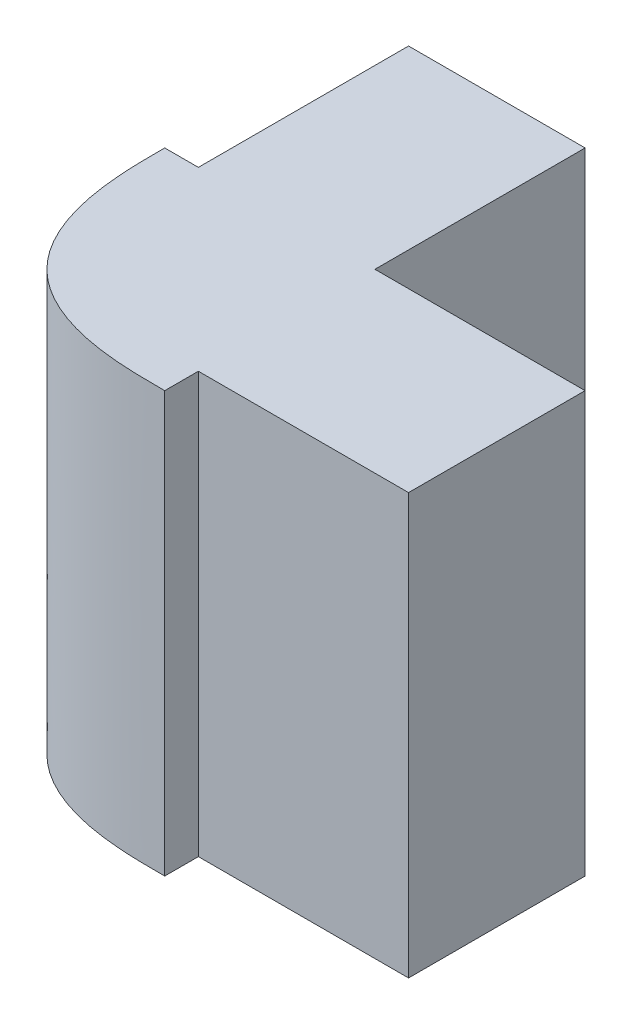
ISO-10303-21;
HEADER;
FILE_DESCRIPTION(('STEP AP214'),'2;1');
FILE_NAME('part.step','',(''),(''),'','','');
FILE_SCHEMA(('AUTOMOTIVE_DESIGN { 1 0 10303 214 1 1 1 1 }'));
ENDSEC;
DATA;
#1=APPLICATION_CONTEXT('core data for automotive mechanical design processes');
#2=APPLICATION_PROTOCOL_DEFINITION('international standard','automotive_design',2000,#1);
#3=PRODUCT_CONTEXT('',#1,'mechanical');
#4=PRODUCT('Part','Part','',(#3));
#5=PRODUCT_RELATED_PRODUCT_CATEGORY('part','',(#4));
#6=PRODUCT_DEFINITION_FORMATION('','',#4);
#7=PRODUCT_DEFINITION_CONTEXT('part definition',#1,'design');
#8=PRODUCT_DEFINITION('design','',#6,#7);
#9=PRODUCT_DEFINITION_SHAPE('','',#8);
#10=(LENGTH_UNIT() NAMED_UNIT(*) SI_UNIT(.MILLI.,.METRE.));
#11=(NAMED_UNIT(*) PLANE_ANGLE_UNIT() SI_UNIT($,.RADIAN.));
#12=(NAMED_UNIT(*) SI_UNIT($,.STERADIAN.) SOLID_ANGLE_UNIT());
#13=UNCERTAINTY_MEASURE_WITH_UNIT(LENGTH_MEASURE(1.E-05),#10,'distance_accuracy_value','');
#14=(GEOMETRIC_REPRESENTATION_CONTEXT(3) GLOBAL_UNCERTAINTY_ASSIGNED_CONTEXT((#13)) GLOBAL_UNIT_ASSIGNED_CONTEXT((#10,
#11,#12)) REPRESENTATION_CONTEXT('',''));
#15=CARTESIAN_POINT('',(0.,0.,0.));
#16=DIRECTION('',(0.,0.,1.));
#17=DIRECTION('',(1.,0.,0.));
#18=AXIS2_PLACEMENT_3D('',#15,#16,#17);
#19=CARTESIAN_POINT('',(-20.,40.,20.));
#20=DIRECTION('',(0.,0.,1.));
#21=DIRECTION('',(1.,0.,0.));
#22=AXIS2_PLACEMENT_3D('',#19,#20,#21);
#23=PLANE('',#22);
#24=DIRECTION('',(-1.,0.,0.));
#25=VECTOR('',#24,1.);
#26=CARTESIAN_POINT('',(-20.,0.,20.));
#27=LINE('',#26,#25);
#28=CARTESIAN_POINT('',(0.,0.,20.));
#29=VERTEX_POINT('',#28);
#30=CARTESIAN_POINT('',(-20.,0.,20.));
#31=VERTEX_POINT('',#30);
#32=EDGE_CURVE('E155',#29,#31,#27,.T.);
#33=ORIENTED_EDGE('',*,*,#32,.T.);
#34=DIRECTION('',(0.,-1.,0.));
#35=VECTOR('',#34,1.);
#36=CARTESIAN_POINT('',(-20.,40.,20.));
#37=LINE('',#36,#35);
#38=CARTESIAN_POINT('',(-20.,40.,20.));
#39=VERTEX_POINT('',#38);
#40=EDGE_CURVE('E180',#39,#31,#37,.T.);
#41=ORIENTED_EDGE('',*,*,#40,.F.);
#42=DIRECTION('',(-1.,0.,0.));
#43=VECTOR('',#42,1.);
#44=CARTESIAN_POINT('',(-20.,40.,20.));
#45=LINE('',#44,#43);
#46=CARTESIAN_POINT('',(0.,40.,20.));
#47=VERTEX_POINT('',#46);
#48=EDGE_CURVE('E167',#47,#39,#45,.T.);
#49=ORIENTED_EDGE('',*,*,#48,.F.);
#50=DIRECTION('',(0.,-1.,0.));
#51=VECTOR('',#50,1.);
#52=CARTESIAN_POINT('',(0.,40.,20.));
#53=LINE('',#52,#51);
#54=EDGE_CURVE('E149',#47,#29,#53,.T.);
#55=ORIENTED_EDGE('',*,*,#54,.T.);
#56=EDGE_LOOP('',(#33,#41,#49,#55));
#57=FACE_BOUND('',#56,.T.);
#58=ADVANCED_FACE('F42',(#57),#23,.F.);
#59=CARTESIAN_POINT('',(-20.,40.,0.));
#60=DIRECTION('',(-1.,0.,0.));
#61=DIRECTION('',(0.,0.,1.));
#62=AXIS2_PLACEMENT_3D('',#59,#60,#61);
#63=PLANE('',#62);
#64=DIRECTION('',(0.,0.,-1.));
#65=VECTOR('',#64,1.);
#66=CARTESIAN_POINT('',(-20.,0.,0.));
#67=LINE('',#66,#65);
#68=CARTESIAN_POINT('',(-20.,0.,0.));
#69=VERTEX_POINT('',#68);
#70=EDGE_CURVE('E158',#31,#69,#67,.T.);
#71=ORIENTED_EDGE('',*,*,#70,.T.);
#72=DIRECTION('',(0.,-1.,0.));
#73=VECTOR('',#72,1.);
#74=CARTESIAN_POINT('',(-20.,40.,0.));
#75=LINE('',#74,#73);
#76=CARTESIAN_POINT('',(-20.,40.,0.));
#77=VERTEX_POINT('',#76);
#78=EDGE_CURVE('E177',#77,#69,#75,.T.);
#79=ORIENTED_EDGE('',*,*,#78,.F.);
#80=DIRECTION('',(0.,0.,-1.));
#81=VECTOR('',#80,1.);
#82=CARTESIAN_POINT('',(-20.,40.,0.));
#83=LINE('',#82,#81);
#84=EDGE_CURVE('E113',#39,#77,#83,.T.);
#85=ORIENTED_EDGE('',*,*,#84,.F.);
#86=ORIENTED_EDGE('',*,*,#40,.T.);
#87=EDGE_LOOP('',(#71,#79,#85,#86));
#88=FACE_BOUND('',#87,.T.);
#89=ADVANCED_FACE('F293',(#88),#63,.F.);
#90=CARTESIAN_POINT('',(-36.8,40.,0.));
#91=DIRECTION('',(0.,0.,1.));
#92=DIRECTION('',(1.,0.,0.));
#93=AXIS2_PLACEMENT_3D('',#90,#91,#92);
#94=PLANE('',#93);
#95=DIRECTION('',(-1.,0.,0.));
#96=VECTOR('',#95,1.);
#97=CARTESIAN_POINT('',(-36.8,0.,0.));
#98=LINE('',#97,#96);
#99=CARTESIAN_POINT('',(-36.8,0.,0.));
#100=VERTEX_POINT('',#99);
#101=EDGE_CURVE('E160',#69,#100,#98,.T.);
#102=ORIENTED_EDGE('',*,*,#101,.T.);
#103=DIRECTION('',(0.,-1.,0.));
#104=VECTOR('',#103,1.);
#105=CARTESIAN_POINT('',(-36.8,40.,0.));
#106=LINE('',#105,#104);
#107=CARTESIAN_POINT('',(-36.8,40.,0.));
#108=VERTEX_POINT('',#107);
#109=EDGE_CURVE('E173',#108,#100,#106,.T.);
#110=ORIENTED_EDGE('',*,*,#109,.F.);
#111=DIRECTION('',(-1.,0.,0.));
#112=VECTOR('',#111,1.);
#113=CARTESIAN_POINT('',(-36.8,40.,0.));
#114=LINE('',#113,#112);
#115=EDGE_CURVE('E285',#77,#108,#114,.T.);
#116=ORIENTED_EDGE('',*,*,#115,.F.);
#117=ORIENTED_EDGE('',*,*,#78,.T.);
#118=EDGE_LOOP('',(#102,#110,#116,#117));
#119=FACE_BOUND('',#118,.T.);
#120=ADVANCED_FACE('F292',(#119),#94,.F.);
#121=CARTESIAN_POINT('',(-36.8,40.,20.));
#122=DIRECTION('',(1.,0.,0.));
#123=DIRECTION('',(0.,0.,-1.));
#124=AXIS2_PLACEMENT_3D('',#121,#122,#123);
#125=PLANE('',#124);
#126=DIRECTION('',(0.,0.,1.));
#127=VECTOR('',#126,1.);
#128=CARTESIAN_POINT('',(-36.8,0.,20.));
#129=LINE('',#128,#127);
#130=CARTESIAN_POINT('',(-36.8,0.,20.));
#131=VERTEX_POINT('',#130);
#132=EDGE_CURVE('E162',#100,#131,#129,.T.);
#133=ORIENTED_EDGE('',*,*,#132,.T.);
#134=DIRECTION('',(0.,-1.,0.));
#135=VECTOR('',#134,1.);
#136=CARTESIAN_POINT('',(-36.8,40.,20.));
#137=LINE('',#136,#135);
#138=CARTESIAN_POINT('',(-36.8,40.,20.));
#139=VERTEX_POINT('',#138);
#140=EDGE_CURVE('E170',#139,#131,#137,.T.);
#141=ORIENTED_EDGE('',*,*,#140,.F.);
#142=DIRECTION('',(0.,0.,1.));
#143=VECTOR('',#142,1.);
#144=CARTESIAN_POINT('',(-36.8,40.,20.));
#145=LINE('',#144,#143);
#146=EDGE_CURVE('E152',#108,#139,#145,.T.);
#147=ORIENTED_EDGE('',*,*,#146,.F.);
#148=ORIENTED_EDGE('',*,*,#109,.T.);
#149=EDGE_LOOP('',(#133,#141,#147,#148));
#150=FACE_BOUND('',#149,.T.);
#151=ADVANCED_FACE('F213',(#150),#125,.F.);
#152=CARTESIAN_POINT('',(-40.,40.,20.));
#153=DIRECTION('',(0.,0.,1.));
#154=DIRECTION('',(1.,0.,0.));
#155=AXIS2_PLACEMENT_3D('',#152,#153,#154);
#156=PLANE('',#155);
#157=DIRECTION('',(-1.,0.,0.));
#158=VECTOR('',#157,1.);
#159=CARTESIAN_POINT('',(-40.,0.,20.));
#160=LINE('',#159,#158);
#161=CARTESIAN_POINT('',(-40.,0.,20.));
#162=VERTEX_POINT('',#161);
#163=EDGE_CURVE('E164',#131,#162,#160,.T.);
#164=ORIENTED_EDGE('',*,*,#163,.T.);
#165=CARTESIAN_POINT('',(-40.,42.,20.));
#166=CARTESIAN_POINT('',(-40.,27.3333333333206,20.));
#167=CARTESIAN_POINT('',(-40.,12.6666666666667,20.));
#168=CARTESIAN_POINT('',(-40.,-2.,20.));
#169=B_SPLINE_CURVE_WITH_KNOTS('',3,(#165,#166,#167,#168),.UNSPECIFIED.,.F.,.F.,(4,4),(-0.002,
0.042),.UNSPECIFIED.);
#170=CARTESIAN_POINT('',(-40.,40.,20.));
#171=VERTEX_POINT('',#170);
#172=EDGE_CURVE('E174',#171,#162,#169,.T.);
#173=ORIENTED_EDGE('',*,*,#172,.F.);
#174=DIRECTION('',(-1.,0.,0.));
#175=VECTOR('',#174,1.);
#176=CARTESIAN_POINT('',(-40.,40.,20.));
#177=LINE('',#176,#175);
#178=EDGE_CURVE('E138',#139,#171,#177,.T.);
#179=ORIENTED_EDGE('',*,*,#178,.F.);
#180=ORIENTED_EDGE('',*,*,#140,.T.);
#181=EDGE_LOOP('',(#164,#173,#179,#180));
#182=FACE_BOUND('',#181,.T.);
#183=ADVANCED_FACE('F209',(#182),#156,.F.);
#184=CARTESIAN_POINT('',(-20.,40.,40.));
#185=DIRECTION('',(-1.,0.,0.));
#186=DIRECTION('',(0.,0.,1.));
#187=AXIS2_PLACEMENT_3D('',#184,#185,#186);
#188=PLANE('',#187);
#189=DIRECTION('',(0.,0.,-1.));
#190=VECTOR('',#189,1.);
#191=CARTESIAN_POINT('',(-20.,0.,40.));
#192=LINE('',#191,#190);
#193=CARTESIAN_POINT('',(-20.,0.,40.));
#194=VERTEX_POINT('',#193);
#195=CARTESIAN_POINT('',(-20.,0.,36.8));
#196=VERTEX_POINT('',#195);
#197=EDGE_CURVE('E143',#194,#196,#192,.T.);
#198=ORIENTED_EDGE('',*,*,#197,.T.);
#199=DIRECTION('',(0.,-1.,0.));
#200=VECTOR('',#199,1.);
#201=CARTESIAN_POINT('',(-20.,40.,36.8));
#202=LINE('',#201,#200);
#203=CARTESIAN_POINT('',(-20.,40.,36.8));
#204=VERTEX_POINT('',#203);
#205=EDGE_CURVE('E140',#204,#196,#202,.T.);
#206=ORIENTED_EDGE('',*,*,#205,.F.);
#207=DIRECTION('',(0.,0.,-1.));
#208=VECTOR('',#207,1.);
#209=CARTESIAN_POINT('',(-20.,40.,40.));
#210=LINE('',#209,#208);
#211=CARTESIAN_POINT('',(-20.,40.,40.));
#212=VERTEX_POINT('',#211);
#213=EDGE_CURVE('E128',#212,#204,#210,.T.);
#214=ORIENTED_EDGE('',*,*,#213,.F.);
#215=CARTESIAN_POINT('',(-20.,-2.,40.));
#216=CARTESIAN_POINT('',(-20.,12.6666666666667,40.));
#217=CARTESIAN_POINT('',(-20.,27.3333333333206,40.));
#218=CARTESIAN_POINT('',(-20.,42.,40.));
#219=B_SPLINE_CURVE_WITH_KNOTS('',3,(#215,#216,#217,#218),.UNSPECIFIED.,.F.,.F.,(4,4),(-0.002,
0.042),.UNSPECIFIED.);
#220=EDGE_CURVE('E144',#212,#194,#219,.F.);
#221=ORIENTED_EDGE('',*,*,#220,.T.);
#222=EDGE_LOOP('',(#198,#206,#214,#221));
#223=FACE_BOUND('',#222,.T.);
#224=ADVANCED_FACE('F141',(#223),#188,.F.);
#225=CARTESIAN_POINT('',(-20.,40.,36.8));
#226=DIRECTION('',(0.,0.,-1.));
#227=DIRECTION('',(-1.,0.,0.));
#228=AXIS2_PLACEMENT_3D('',#225,#226,#227);
#229=PLANE('',#228);
#230=DIRECTION('',(1.,0.,0.));
#231=VECTOR('',#230,1.);
#232=CARTESIAN_POINT('',(-20.,0.,36.8));
#233=LINE('',#232,#231);
#234=CARTESIAN_POINT('',(0.,0.,36.8));
#235=VERTEX_POINT('',#234);
#236=EDGE_CURVE('E98',#196,#235,#233,.T.);
#237=ORIENTED_EDGE('',*,*,#236,.T.);
#238=DIRECTION('',(0.,-1.,0.));
#239=VECTOR('',#238,1.);
#240=CARTESIAN_POINT('',(0.,40.,36.8));
#241=LINE('',#240,#239);
#242=CARTESIAN_POINT('',(0.,40.,36.8));
#243=VERTEX_POINT('',#242);
#244=EDGE_CURVE('E145',#243,#235,#241,.T.);
#245=ORIENTED_EDGE('',*,*,#244,.F.);
#246=DIRECTION('',(1.,0.,0.));
#247=VECTOR('',#246,1.);
#248=CARTESIAN_POINT('',(-20.,40.,36.8));
#249=LINE('',#248,#247);
#250=EDGE_CURVE('E132',#204,#243,#249,.T.);
#251=ORIENTED_EDGE('',*,*,#250,.F.);
#252=ORIENTED_EDGE('',*,*,#205,.T.);
#253=EDGE_LOOP('',(#237,#245,#251,#252));
#254=FACE_BOUND('',#253,.T.);
#255=ADVANCED_FACE('F147',(#254),#229,.F.);
#256=CARTESIAN_POINT('',(0.,40.,20.));
#257=DIRECTION('',(-1.,0.,0.));
#258=DIRECTION('',(0.,0.,1.));
#259=AXIS2_PLACEMENT_3D('',#256,#257,#258);
#260=PLANE('',#259);
#261=DIRECTION('',(0.,0.,-1.));
#262=VECTOR('',#261,1.);
#263=CARTESIAN_POINT('',(0.,0.,20.));
#264=LINE('',#263,#262);
#265=EDGE_CURVE('E104',#235,#29,#264,.T.);
#266=ORIENTED_EDGE('',*,*,#265,.T.);
#267=ORIENTED_EDGE('',*,*,#54,.F.);
#268=DIRECTION('',(0.,0.,-1.));
#269=VECTOR('',#268,1.);
#270=CARTESIAN_POINT('',(0.,40.,20.));
#271=LINE('',#270,#269);
#272=EDGE_CURVE('E66',#243,#47,#271,.T.);
#273=ORIENTED_EDGE('',*,*,#272,.F.);
#274=ORIENTED_EDGE('',*,*,#244,.T.);
#275=EDGE_LOOP('',(#266,#267,#273,#274));
#276=FACE_BOUND('',#275,.T.);
#277=ADVANCED_FACE('F202',(#276),#260,.F.);
#278=CARTESIAN_POINT('',(0.,40.,0.));
#279=DIRECTION('',(0.,-1.,0.));
#280=DIRECTION('',(0.,0.,-1.));
#281=AXIS2_PLACEMENT_3D('',#278,#279,#280);
#282=PLANE('',#281);
#283=ORIENTED_EDGE('',*,*,#178,.T.);
#284=CARTESIAN_POINT('',(-20.,40.,40.));
#285=CARTESIAN_POINT('',(-23.3639610306789,40.,40.));
#286=CARTESIAN_POINT('',(-26.7279220613579,40.,40.));
#287=CARTESIAN_POINT('',(-34.1421356237309,40.,38.5661616032783));
#288=CARTESIAN_POINT('',(-38.5661616032783,40.,34.1421356237309));
#289=CARTESIAN_POINT('',(-40.,40.,26.7279220613579));
#290=CARTESIAN_POINT('',(-40.,40.,23.3639610306789));
#291=CARTESIAN_POINT('',(-40.,40.,20.));
#292=B_SPLINE_CURVE_WITH_KNOTS('',5,(#284,#285,#286,#287,#288,#289,#290,#291),.UNSPECIFIED.,.F.,
.F.,(6,2,6),(0.,0.5,1.),.UNSPECIFIED.);
#293=EDGE_CURVE('E11',#171,#212,#292,.F.);
#294=ORIENTED_EDGE('',*,*,#293,.T.);
#295=ORIENTED_EDGE('',*,*,#213,.T.);
#296=ORIENTED_EDGE('',*,*,#250,.T.);
#297=ORIENTED_EDGE('',*,*,#272,.T.);
#298=ORIENTED_EDGE('',*,*,#48,.T.);
#299=ORIENTED_EDGE('',*,*,#84,.T.);
#300=ORIENTED_EDGE('',*,*,#115,.T.);
#301=ORIENTED_EDGE('',*,*,#146,.T.);
#302=EDGE_LOOP('',(#283,#294,#295,#296,#297,#298,#299,#300,#301));
#303=FACE_BOUND('',#302,.T.);
#304=ADVANCED_FACE('F130',(#303),#282,.F.);
#305=CARTESIAN_POINT('',(0.,0.,0.));
#306=DIRECTION('',(0.,-1.,0.));
#307=DIRECTION('',(0.,0.,-1.));
#308=AXIS2_PLACEMENT_3D('',#305,#306,#307);
#309=PLANE('',#308);
#310=ORIENTED_EDGE('',*,*,#197,.F.);
#311=CARTESIAN_POINT('',(-40.,0.,20.));
#312=CARTESIAN_POINT('',(-40.,0.,23.3639610306789));
#313=CARTESIAN_POINT('',(-40.,0.,26.7279220613579));
#314=CARTESIAN_POINT('',(-38.5661616032783,0.,34.1421356237309));
#315=CARTESIAN_POINT('',(-34.1421356237309,0.,38.5661616032783));
#316=CARTESIAN_POINT('',(-26.7279220613579,0.,40.));
#317=CARTESIAN_POINT('',(-23.3639610306789,0.,40.));
#318=CARTESIAN_POINT('',(-20.,0.,40.));
#319=B_SPLINE_CURVE_WITH_KNOTS('',5,(#311,#312,#313,#314,#315,#316,#317,#318),.UNSPECIFIED.,.F.,
.F.,(6,2,6),(0.,0.5,1.),.UNSPECIFIED.);
#320=EDGE_CURVE('E58',#194,#162,#319,.F.);
#321=ORIENTED_EDGE('',*,*,#320,.T.);
#322=ORIENTED_EDGE('',*,*,#163,.F.);
#323=ORIENTED_EDGE('',*,*,#132,.F.);
#324=ORIENTED_EDGE('',*,*,#101,.F.);
#325=ORIENTED_EDGE('',*,*,#70,.F.);
#326=ORIENTED_EDGE('',*,*,#32,.F.);
#327=ORIENTED_EDGE('',*,*,#265,.F.);
#328=ORIENTED_EDGE('',*,*,#236,.F.);
#329=EDGE_LOOP('',(#310,#321,#322,#323,#324,#325,#326,#327,#328));
#330=FACE_BOUND('',#329,.T.);
#331=ADVANCED_FACE('F191',(#330),#309,.T.);
#332=CARTESIAN_POINT('',(-20.,42.,40.));
#333=CARTESIAN_POINT('',(-20.,27.3333333333206,40.));
#334=CARTESIAN_POINT('',(-20.,12.6666666666667,40.));
#335=CARTESIAN_POINT('',(-20.,-2.,40.));
#336=CARTESIAN_POINT('',(-23.3639610306789,42.,40.));
#337=CARTESIAN_POINT('',(-23.3639610306789,27.3333333333206,40.));
#338=CARTESIAN_POINT('',(-23.3639610306789,12.6666666666667,40.));
#339=CARTESIAN_POINT('',(-23.3639610306789,-2.,40.));
#340=CARTESIAN_POINT('',(-26.7279220613579,42.,40.));
#341=CARTESIAN_POINT('',(-26.7279220613579,27.3333333333206,40.));
#342=CARTESIAN_POINT('',(-26.7279220613579,12.6666666666667,40.));
#343=CARTESIAN_POINT('',(-26.7279220613579,-2.,40.));
#344=CARTESIAN_POINT('',(-34.1421356237309,42.,38.5661616032783));
#345=CARTESIAN_POINT('',(-34.1421356237309,27.3333333333206,38.5661616032783));
#346=CARTESIAN_POINT('',(-34.1421356237309,12.6666666666667,38.5661616032783));
#347=CARTESIAN_POINT('',(-34.1421356237309,-2.,38.5661616032783));
#348=CARTESIAN_POINT('',(-38.5661616032783,42.,34.1421356237309));
#349=CARTESIAN_POINT('',(-38.5661616032783,27.3333333333206,34.1421356237309));
#350=CARTESIAN_POINT('',(-38.5661616032783,12.6666666666667,34.1421356237309));
#351=CARTESIAN_POINT('',(-38.5661616032783,-2.,34.1421356237309));
#352=CARTESIAN_POINT('',(-40.,42.,26.7279220613579));
#353=CARTESIAN_POINT('',(-40.,27.3333333333206,26.7279220613579));
#354=CARTESIAN_POINT('',(-40.,12.6666666666667,26.7279220613579));
#355=CARTESIAN_POINT('',(-40.,-2.,26.7279220613579));
#356=CARTESIAN_POINT('',(-40.,42.,23.3639610306789));
#357=CARTESIAN_POINT('',(-40.,27.3333333333206,23.3639610306789));
#358=CARTESIAN_POINT('',(-40.,12.6666666666667,23.3639610306789));
#359=CARTESIAN_POINT('',(-40.,-2.,23.3639610306789));
#360=CARTESIAN_POINT('',(-40.,42.,20.));
#361=CARTESIAN_POINT('',(-40.,27.3333333333206,20.));
#362=CARTESIAN_POINT('',(-40.,12.6666666666667,20.));
#363=CARTESIAN_POINT('',(-40.,-2.,20.));
#364=B_SPLINE_SURFACE_WITH_KNOTS('',5,3,((#332,#333,#334,#335),(#336,#337,#338,#339),(#340,#341,
#342,#343),(#344,#345,#346,#347),(#348,#349,#350,#351),(#352,#353,#354,#355),(#356,#357,#358,
#359),(#360,#361,#362,#363)),.UNSPECIFIED.,.F.,.F.,.F.,(6,2,6),(4,4),(0.,0.5,1.),(-0.002,0.042),.UNSPECIFIED.);
#365=ORIENTED_EDGE('',*,*,#293,.F.);
#366=ORIENTED_EDGE('',*,*,#172,.T.);
#367=ORIENTED_EDGE('',*,*,#320,.F.);
#368=ORIENTED_EDGE('',*,*,#220,.F.);
#369=EDGE_LOOP('',(#365,#366,#367,#368));
#370=FACE_BOUND('',#369,.T.);
#371=ADVANCED_FACE('F45',(#370),#364,.T.);
#372=CLOSED_SHELL('',(#58,#89,#120,#151,#183,#224,#255,#277,#304,#331,#371));
#373=MANIFOLD_SOLID_BREP('B2',#372);
#374=ADVANCED_BREP_SHAPE_REPRESENTATION('',(#18,#373),#14);
#375=SHAPE_DEFINITION_REPRESENTATION(#9,#374);
ENDSEC;
END-ISO-10303-21;
